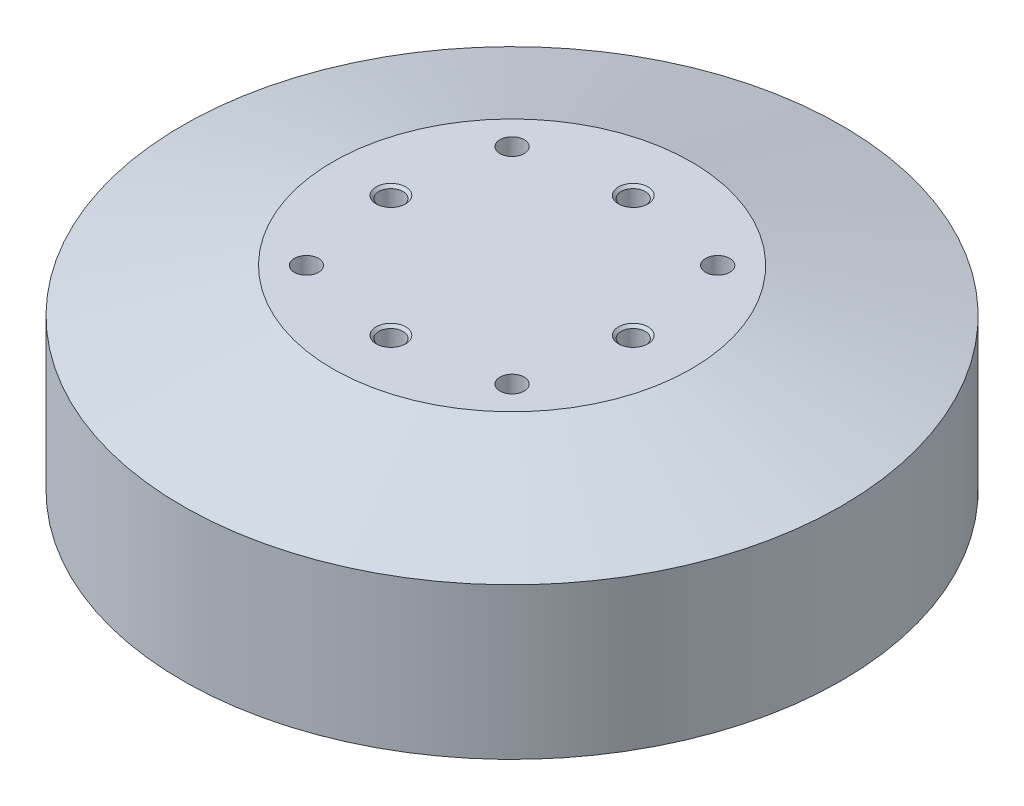
ISO-10303-21;
HEADER;
FILE_DESCRIPTION(('STEP AP214'),'2;1');
FILE_NAME('part.step','',(''),(''),'','','');
FILE_SCHEMA(('AUTOMOTIVE_DESIGN { 1 0 10303 214 1 1 1 1 }'));
ENDSEC;
DATA;
#1=APPLICATION_CONTEXT('core data for automotive mechanical design processes');
#2=APPLICATION_PROTOCOL_DEFINITION('international standard','automotive_design',2000,#1);
#3=PRODUCT_CONTEXT('',#1,'mechanical');
#4=PRODUCT('Part','Part','',(#3));
#5=PRODUCT_RELATED_PRODUCT_CATEGORY('part','',(#4));
#6=PRODUCT_DEFINITION_FORMATION('','',#4);
#7=PRODUCT_DEFINITION_CONTEXT('part definition',#1,'design');
#8=PRODUCT_DEFINITION('design','',#6,#7);
#9=PRODUCT_DEFINITION_SHAPE('','',#8);
#10=(LENGTH_UNIT() NAMED_UNIT(*) SI_UNIT(.MILLI.,.METRE.));
#11=(NAMED_UNIT(*) PLANE_ANGLE_UNIT() SI_UNIT($,.RADIAN.));
#12=(NAMED_UNIT(*) SI_UNIT($,.STERADIAN.) SOLID_ANGLE_UNIT());
#13=UNCERTAINTY_MEASURE_WITH_UNIT(LENGTH_MEASURE(1.E-05),#10,'distance_accuracy_value','');
#14=(GEOMETRIC_REPRESENTATION_CONTEXT(3) GLOBAL_UNCERTAINTY_ASSIGNED_CONTEXT((#13)) GLOBAL_UNIT_ASSIGNED_CONTEXT((#10,
#11,#12)) REPRESENTATION_CONTEXT('',''));
#15=CARTESIAN_POINT('',(0.,0.,0.));
#16=DIRECTION('',(0.,0.,1.));
#17=DIRECTION('',(1.,0.,0.));
#18=AXIS2_PLACEMENT_3D('',#15,#16,#17);
#19=CARTESIAN_POINT('',(0.,-10.05,0.));
#20=DIRECTION('',(0.,-1.,0.));
#21=DIRECTION('',(1.,0.,0.));
#22=AXIS2_PLACEMENT_3D('',#19,#20,#21);
#23=CYLINDRICAL_SURFACE('',#22,34.);
#24=CARTESIAN_POINT('',(0.,5.55,0.));
#25=DIRECTION('',(0.,-1.,0.));
#26=DIRECTION('',(1.,0.,0.));
#27=AXIS2_PLACEMENT_3D('',#24,#25,#26);
#28=CIRCLE('',#27,34.);
#29=CARTESIAN_POINT('',(34.,5.55,0.));
#30=VERTEX_POINT('',#29);
#31=EDGE_CURVE('E142',#30,#30,#28,.T.);
#32=ORIENTED_EDGE('',*,*,#31,.T.);
#33=EDGE_LOOP('',(#32));
#34=FACE_BOUND('',#33,.T.);
#35=CARTESIAN_POINT('',(0.,-10.05,0.));
#36=DIRECTION('',(0.,-1.,0.));
#37=DIRECTION('',(1.,0.,0.));
#38=AXIS2_PLACEMENT_3D('',#35,#36,#37);
#39=CIRCLE('',#38,34.);
#40=CARTESIAN_POINT('',(34.,-10.05,0.));
#41=VERTEX_POINT('',#40);
#42=EDGE_CURVE('E11',#41,#41,#39,.T.);
#43=ORIENTED_EDGE('',*,*,#42,.F.);
#44=EDGE_LOOP('',(#43));
#45=FACE_BOUND('',#44,.T.);
#46=ADVANCED_FACE('F38',(#34,#45),#23,.T.);
#47=CARTESIAN_POINT('',(34.,-10.05,0.));
#48=DIRECTION('',(0.,-1.,0.));
#49=DIRECTION('',(1.,0.,0.));
#50=AXIS2_PLACEMENT_3D('',#47,#48,#49);
#51=PLANE('',#50);
#52=CARTESIAN_POINT('',(0.,-10.05,0.));
#53=DIRECTION('',(0.,-1.,0.));
#54=DIRECTION('',(1.,0.,0.));
#55=AXIS2_PLACEMENT_3D('',#52,#53,#54);
#56=CIRCLE('',#55,33.);
#57=CARTESIAN_POINT('',(33.,-10.05,0.));
#58=VERTEX_POINT('',#57);
#59=EDGE_CURVE('E138',#58,#58,#56,.T.);
#60=ORIENTED_EDGE('',*,*,#59,.F.);
#61=EDGE_LOOP('',(#60));
#62=FACE_BOUND('',#61,.T.);
#63=ORIENTED_EDGE('',*,*,#42,.T.);
#64=EDGE_LOOP('',(#63));
#65=FACE_BOUND('',#64,.T.);
#66=ADVANCED_FACE('F154',(#62,#65),#51,.T.);
#67=CARTESIAN_POINT('',(0.,10.05,0.));
#68=DIRECTION('',(0.,1.,0.));
#69=DIRECTION('',(-1.,0.,0.));
#70=AXIS2_PLACEMENT_3D('',#67,#68,#69);
#71=PLANE('',#70);
#72=CARTESIAN_POINT('',(0.,10.05,-12.5));
#73=DIRECTION('',(0.,1.,0.));
#74=DIRECTION('',(0.,0.,1.));
#75=AXIS2_PLACEMENT_3D('',#72,#73,#74);
#76=CIRCLE('',#75,1.525);
#77=CARTESIAN_POINT('',(0.,10.05,-10.975));
#78=VERTEX_POINT('',#77);
#79=EDGE_CURVE('E87',#78,#78,#76,.T.);
#80=ORIENTED_EDGE('',*,*,#79,.F.);
#81=EDGE_LOOP('',(#80));
#82=FACE_BOUND('',#81,.T.);
#83=CARTESIAN_POINT('',(0.,10.05,12.5));
#84=DIRECTION('',(0.,1.,0.));
#85=DIRECTION('',(0.,0.,1.));
#86=AXIS2_PLACEMENT_3D('',#83,#84,#85);
#87=CIRCLE('',#86,1.525);
#88=CARTESIAN_POINT('',(0.,10.05,14.025));
#89=VERTEX_POINT('',#88);
#90=EDGE_CURVE('E80',#89,#89,#87,.T.);
#91=ORIENTED_EDGE('',*,*,#90,.F.);
#92=EDGE_LOOP('',(#91));
#93=FACE_BOUND('',#92,.T.);
#94=CARTESIAN_POINT('',(-12.5,10.05,0.));
#95=DIRECTION('',(0.,1.,0.));
#96=DIRECTION('',(0.,0.,1.));
#97=AXIS2_PLACEMENT_3D('',#94,#95,#96);
#98=CIRCLE('',#97,1.525);
#99=CARTESIAN_POINT('',(-12.5,10.05,1.525));
#100=VERTEX_POINT('',#99);
#101=EDGE_CURVE('E96',#100,#100,#98,.T.);
#102=ORIENTED_EDGE('',*,*,#101,.F.);
#103=EDGE_LOOP('',(#102));
#104=FACE_BOUND('',#103,.T.);
#105=CARTESIAN_POINT('',(12.5,10.05,0.));
#106=DIRECTION('',(0.,1.,0.));
#107=DIRECTION('',(0.,0.,1.));
#108=AXIS2_PLACEMENT_3D('',#105,#106,#107);
#109=CIRCLE('',#108,1.525);
#110=CARTESIAN_POINT('',(12.5,10.05,1.525));
#111=VERTEX_POINT('',#110);
#112=EDGE_CURVE('E105',#111,#111,#109,.T.);
#113=ORIENTED_EDGE('',*,*,#112,.F.);
#114=EDGE_LOOP('',(#113));
#115=FACE_BOUND('',#114,.T.);
#116=CARTESIAN_POINT('',(-10.6066017177982,10.05,-10.6066017177982));
#117=DIRECTION('',(0.,1.,0.));
#118=DIRECTION('',(0.,0.,1.));
#119=AXIS2_PLACEMENT_3D('',#116,#117,#118);
#120=CIRCLE('',#119,1.24999999999999);
#121=CARTESIAN_POINT('',(-10.6066017177982,10.05,-9.35660171779824));
#122=VERTEX_POINT('',#121);
#123=EDGE_CURVE('E114',#122,#122,#120,.T.);
#124=ORIENTED_EDGE('',*,*,#123,.F.);
#125=EDGE_LOOP('',(#124));
#126=FACE_BOUND('',#125,.T.);
#127=CARTESIAN_POINT('',(10.6066017177982,10.05,-10.6066017177982));
#128=DIRECTION('',(0.,1.,0.));
#129=DIRECTION('',(0.,0.,1.));
#130=AXIS2_PLACEMENT_3D('',#127,#128,#129);
#131=CIRCLE('',#130,1.24999999999999);
#132=CARTESIAN_POINT('',(10.6066017177982,10.05,-9.35660171779821));
#133=VERTEX_POINT('',#132);
#134=EDGE_CURVE('E120',#133,#133,#131,.T.);
#135=ORIENTED_EDGE('',*,*,#134,.F.);
#136=EDGE_LOOP('',(#135));
#137=FACE_BOUND('',#136,.T.);
#138=CARTESIAN_POINT('',(10.6066017177982,10.05,10.6066017177982));
#139=DIRECTION('',(0.,1.,0.));
#140=DIRECTION('',(0.,0.,1.));
#141=AXIS2_PLACEMENT_3D('',#138,#139,#140);
#142=CIRCLE('',#141,1.24999999999999);
#143=CARTESIAN_POINT('',(10.6066017177982,10.05,11.8566017177982));
#144=VERTEX_POINT('',#143);
#145=EDGE_CURVE('E126',#144,#144,#142,.T.);
#146=ORIENTED_EDGE('',*,*,#145,.F.);
#147=EDGE_LOOP('',(#146));
#148=FACE_BOUND('',#147,.T.);
#149=CARTESIAN_POINT('',(-10.6066017177982,10.05,10.6066017177982));
#150=DIRECTION('',(0.,1.,0.));
#151=DIRECTION('',(0.,0.,1.));
#152=AXIS2_PLACEMENT_3D('',#149,#150,#151);
#153=CIRCLE('',#152,1.24999999999999);
#154=CARTESIAN_POINT('',(-10.6066017177982,10.05,11.8566017177982));
#155=VERTEX_POINT('',#154);
#156=EDGE_CURVE('E132',#155,#155,#153,.T.);
#157=ORIENTED_EDGE('',*,*,#156,.F.);
#158=EDGE_LOOP('',(#157));
#159=FACE_BOUND('',#158,.T.);
#160=CARTESIAN_POINT('',(0.,10.05,0.));
#161=DIRECTION('',(0.,-1.,0.));
#162=DIRECTION('',(1.,0.,0.));
#163=AXIS2_PLACEMENT_3D('',#160,#161,#162);
#164=CIRCLE('',#163,18.5);
#165=CARTESIAN_POINT('',(18.5,10.05,0.));
#166=VERTEX_POINT('',#165);
#167=EDGE_CURVE('E45',#166,#166,#164,.T.);
#168=ORIENTED_EDGE('',*,*,#167,.F.);
#169=EDGE_LOOP('',(#168));
#170=FACE_BOUND('',#169,.T.);
#171=ADVANCED_FACE('F152',(#82,#93,#104,#115,#126,#137,#148,#159,#170),#71,.T.);
#172=CARTESIAN_POINT('',(0.,5.55,0.));
#173=DIRECTION('',(0.,-1.,0.));
#174=DIRECTION('',(1.,0.,0.));
#175=AXIS2_PLACEMENT_3D('',#172,#173,#174);
#176=CONICAL_SURFACE('',#175,34.,1.28824137432531);
#177=ORIENTED_EDGE('',*,*,#167,.T.);
#178=EDGE_LOOP('',(#177));
#179=FACE_BOUND('',#178,.T.);
#180=ORIENTED_EDGE('',*,*,#31,.F.);
#181=EDGE_LOOP('',(#180));
#182=FACE_BOUND('',#181,.T.);
#183=ADVANCED_FACE('F149',(#179,#182),#176,.T.);
#184=CARTESIAN_POINT('',(0.,-8.05,0.));
#185=DIRECTION('',(0.,-1.,0.));
#186=DIRECTION('',(1.,0.,0.));
#187=AXIS2_PLACEMENT_3D('',#184,#185,#186);
#188=CYLINDRICAL_SURFACE('',#187,33.);
#189=CARTESIAN_POINT('',(0.,-8.05,0.));
#190=DIRECTION('',(0.,-1.,0.));
#191=DIRECTION('',(1.,0.,0.));
#192=AXIS2_PLACEMENT_3D('',#189,#190,#191);
#193=CIRCLE('',#192,33.);
#194=CARTESIAN_POINT('',(33.,-8.04999999999999,0.));
#195=VERTEX_POINT('',#194);
#196=EDGE_CURVE('E139',#195,#195,#193,.T.);
#197=ORIENTED_EDGE('',*,*,#196,.F.);
#198=EDGE_LOOP('',(#197));
#199=FACE_BOUND('',#198,.T.);
#200=ORIENTED_EDGE('',*,*,#59,.T.);
#201=EDGE_LOOP('',(#200));
#202=FACE_BOUND('',#201,.T.);
#203=ADVANCED_FACE('F162',(#199,#202),#188,.F.);
#204=CARTESIAN_POINT('',(0.,-8.05,0.));
#205=DIRECTION('',(0.,-1.,0.));
#206=DIRECTION('',(1.,0.,0.));
#207=AXIS2_PLACEMENT_3D('',#204,#205,#206);
#208=PLANE('',#207);
#209=ORIENTED_EDGE('',*,*,#196,.T.);
#210=EDGE_LOOP('',(#209));
#211=FACE_BOUND('',#210,.T.);
#212=ADVANCED_FACE('F194',(#211),#208,.T.);
#213=CARTESIAN_POINT('',(-10.6066017177982,2.55,10.6066017177982));
#214=DIRECTION('',(0.,1.,0.));
#215=DIRECTION('',(0.,0.,1.));
#216=AXIS2_PLACEMENT_3D('',#213,#214,#215);
#217=CONICAL_SURFACE('',#216,1.25,1.02974425867665);
#218=CARTESIAN_POINT('',(-10.6066017177982,1.79892422621555,10.6066017177982));
#219=VERTEX_POINT('',#218);
#220=VERTEX_LOOP('',#219);
#221=FACE_BOUND('',#220,.T.);
#222=CARTESIAN_POINT('',(-10.6066017177982,2.55,10.6066017177982));
#223=DIRECTION('',(0.,1.,0.));
#224=DIRECTION('',(0.,0.,1.));
#225=AXIS2_PLACEMENT_3D('',#222,#223,#224);
#226=CIRCLE('',#225,1.25);
#227=CARTESIAN_POINT('',(-10.6066017177982,2.55,11.8566017177982));
#228=VERTEX_POINT('',#227);
#229=EDGE_CURVE('E135',#228,#228,#226,.T.);
#230=ORIENTED_EDGE('',*,*,#229,.T.);
#231=EDGE_LOOP('',(#230));
#232=FACE_BOUND('',#231,.T.);
#233=ADVANCED_FACE('F202',(#221,#232),#217,.F.);
#234=CARTESIAN_POINT('',(-10.6066017177982,10.05,10.6066017177982));
#235=DIRECTION('',(0.,1.,0.));
#236=DIRECTION('',(0.,0.,1.));
#237=AXIS2_PLACEMENT_3D('',#234,#235,#236);
#238=CYLINDRICAL_SURFACE('',#237,1.24999999999999);
#239=ORIENTED_EDGE('',*,*,#229,.F.);
#240=EDGE_LOOP('',(#239));
#241=FACE_BOUND('',#240,.T.);
#242=ORIENTED_EDGE('',*,*,#156,.T.);
#243=EDGE_LOOP('',(#242));
#244=FACE_BOUND('',#243,.T.);
#245=ADVANCED_FACE('F210',(#241,#244),#238,.F.);
#246=CARTESIAN_POINT('',(10.6066017177982,2.55,10.6066017177982));
#247=DIRECTION('',(0.,1.,0.));
#248=DIRECTION('',(0.,0.,1.));
#249=AXIS2_PLACEMENT_3D('',#246,#247,#248);
#250=CONICAL_SURFACE('',#249,1.25,1.02974425867665);
#251=CARTESIAN_POINT('',(10.6066017177982,1.79892422621555,10.6066017177982));
#252=VERTEX_POINT('',#251);
#253=VERTEX_LOOP('',#252);
#254=FACE_BOUND('',#253,.T.);
#255=CARTESIAN_POINT('',(10.6066017177982,2.55,10.6066017177982));
#256=DIRECTION('',(0.,1.,0.));
#257=DIRECTION('',(0.,0.,1.));
#258=AXIS2_PLACEMENT_3D('',#255,#256,#257);
#259=CIRCLE('',#258,1.25);
#260=CARTESIAN_POINT('',(10.6066017177982,2.55,11.8566017177982));
#261=VERTEX_POINT('',#260);
#262=EDGE_CURVE('E129',#261,#261,#259,.T.);
#263=ORIENTED_EDGE('',*,*,#262,.T.);
#264=EDGE_LOOP('',(#263));
#265=FACE_BOUND('',#264,.T.);
#266=ADVANCED_FACE('F218',(#254,#265),#250,.F.);
#267=CARTESIAN_POINT('',(10.6066017177982,10.05,10.6066017177982));
#268=DIRECTION('',(0.,1.,0.));
#269=DIRECTION('',(0.,0.,1.));
#270=AXIS2_PLACEMENT_3D('',#267,#268,#269);
#271=CYLINDRICAL_SURFACE('',#270,1.24999999999999);
#272=ORIENTED_EDGE('',*,*,#262,.F.);
#273=EDGE_LOOP('',(#272));
#274=FACE_BOUND('',#273,.T.);
#275=ORIENTED_EDGE('',*,*,#145,.T.);
#276=EDGE_LOOP('',(#275));
#277=FACE_BOUND('',#276,.T.);
#278=ADVANCED_FACE('F227',(#274,#277),#271,.F.);
#279=CARTESIAN_POINT('',(10.6066017177982,2.55,-10.6066017177982));
#280=DIRECTION('',(0.,1.,0.));
#281=DIRECTION('',(0.,0.,1.));
#282=AXIS2_PLACEMENT_3D('',#279,#280,#281);
#283=CONICAL_SURFACE('',#282,1.25,1.02974425867665);
#284=CARTESIAN_POINT('',(10.6066017177982,1.79892422621555,-10.6066017177982));
#285=VERTEX_POINT('',#284);
#286=VERTEX_LOOP('',#285);
#287=FACE_BOUND('',#286,.T.);
#288=CARTESIAN_POINT('',(10.6066017177982,2.55,-10.6066017177982));
#289=DIRECTION('',(0.,1.,0.));
#290=DIRECTION('',(0.,0.,1.));
#291=AXIS2_PLACEMENT_3D('',#288,#289,#290);
#292=CIRCLE('',#291,1.25);
#293=CARTESIAN_POINT('',(10.6066017177982,2.55,-9.3566017177982));
#294=VERTEX_POINT('',#293);
#295=EDGE_CURVE('E123',#294,#294,#292,.T.);
#296=ORIENTED_EDGE('',*,*,#295,.T.);
#297=EDGE_LOOP('',(#296));
#298=FACE_BOUND('',#297,.T.);
#299=ADVANCED_FACE('F234',(#287,#298),#283,.F.);
#300=CARTESIAN_POINT('',(10.6066017177982,10.05,-10.6066017177982));
#301=DIRECTION('',(0.,1.,0.));
#302=DIRECTION('',(0.,0.,1.));
#303=AXIS2_PLACEMENT_3D('',#300,#301,#302);
#304=CYLINDRICAL_SURFACE('',#303,1.24999999999999);
#305=ORIENTED_EDGE('',*,*,#295,.F.);
#306=EDGE_LOOP('',(#305));
#307=FACE_BOUND('',#306,.T.);
#308=ORIENTED_EDGE('',*,*,#134,.T.);
#309=EDGE_LOOP('',(#308));
#310=FACE_BOUND('',#309,.T.);
#311=ADVANCED_FACE('F243',(#307,#310),#304,.F.);
#312=CARTESIAN_POINT('',(-10.6066017177982,2.55,-10.6066017177982));
#313=DIRECTION('',(0.,1.,0.));
#314=DIRECTION('',(0.,0.,1.));
#315=AXIS2_PLACEMENT_3D('',#312,#313,#314);
#316=CONICAL_SURFACE('',#315,1.25,1.02974425867665);
#317=CARTESIAN_POINT('',(-10.6066017177982,1.79892422621555,-10.6066017177982));
#318=VERTEX_POINT('',#317);
#319=VERTEX_LOOP('',#318);
#320=FACE_BOUND('',#319,.T.);
#321=CARTESIAN_POINT('',(-10.6066017177982,2.55,-10.6066017177982));
#322=DIRECTION('',(0.,1.,0.));
#323=DIRECTION('',(0.,0.,1.));
#324=AXIS2_PLACEMENT_3D('',#321,#322,#323);
#325=CIRCLE('',#324,1.25);
#326=CARTESIAN_POINT('',(-10.6066017177982,2.55,-9.35660171779823));
#327=VERTEX_POINT('',#326);
#328=EDGE_CURVE('E117',#327,#327,#325,.T.);
#329=ORIENTED_EDGE('',*,*,#328,.T.);
#330=EDGE_LOOP('',(#329));
#331=FACE_BOUND('',#330,.T.);
#332=ADVANCED_FACE('F251',(#320,#331),#316,.F.);
#333=CARTESIAN_POINT('',(-10.6066017177982,10.05,-10.6066017177982));
#334=DIRECTION('',(0.,1.,0.));
#335=DIRECTION('',(0.,0.,1.));
#336=AXIS2_PLACEMENT_3D('',#333,#334,#335);
#337=CYLINDRICAL_SURFACE('',#336,1.24999999999999);
#338=ORIENTED_EDGE('',*,*,#328,.F.);
#339=EDGE_LOOP('',(#338));
#340=FACE_BOUND('',#339,.T.);
#341=ORIENTED_EDGE('',*,*,#123,.T.);
#342=EDGE_LOOP('',(#341));
#343=FACE_BOUND('',#342,.T.);
#344=ADVANCED_FACE('F260',(#340,#343),#337,.F.);
#345=CARTESIAN_POINT('',(12.5,2.55000000000001,0.));
#346=DIRECTION('',(0.,1.,0.));
#347=DIRECTION('',(0.,0.,1.));
#348=AXIS2_PLACEMENT_3D('',#345,#346,#347);
#349=CONICAL_SURFACE('',#348,1.24999999999999,1.02974425867665);
#350=CARTESIAN_POINT('',(12.5,1.79892422621556,0.));
#351=VERTEX_POINT('',#350);
#352=VERTEX_LOOP('',#351);
#353=FACE_BOUND('',#352,.T.);
#354=CARTESIAN_POINT('',(12.5,2.55000000000001,0.));
#355=DIRECTION('',(0.,1.,0.));
#356=DIRECTION('',(0.,0.,1.));
#357=AXIS2_PLACEMENT_3D('',#354,#355,#356);
#358=CIRCLE('',#357,1.24999999999999);
#359=CARTESIAN_POINT('',(12.5,2.55000000000001,1.24999999999999));
#360=VERTEX_POINT('',#359);
#361=EDGE_CURVE('E111',#360,#360,#358,.T.);
#362=ORIENTED_EDGE('',*,*,#361,.T.);
#363=EDGE_LOOP('',(#362));
#364=FACE_BOUND('',#363,.T.);
#365=ADVANCED_FACE('F267',(#353,#364),#349,.F.);
#366=CARTESIAN_POINT('',(12.5,10.05,0.));
#367=DIRECTION('',(0.,1.,0.));
#368=DIRECTION('',(0.,0.,1.));
#369=AXIS2_PLACEMENT_3D('',#366,#367,#368);
#370=CYLINDRICAL_SURFACE('',#369,1.24999999999999);
#371=ORIENTED_EDGE('',*,*,#361,.F.);
#372=EDGE_LOOP('',(#371));
#373=FACE_BOUND('',#372,.T.);
#374=CARTESIAN_POINT('',(12.5,9.775,0.));
#375=DIRECTION('',(0.,1.,0.));
#376=DIRECTION('',(0.,0.,1.));
#377=AXIS2_PLACEMENT_3D('',#374,#375,#376);
#378=CIRCLE('',#377,1.25);
#379=CARTESIAN_POINT('',(12.5,9.775,1.25));
#380=VERTEX_POINT('',#379);
#381=EDGE_CURVE('E108',#380,#380,#378,.T.);
#382=ORIENTED_EDGE('',*,*,#381,.T.);
#383=EDGE_LOOP('',(#382));
#384=FACE_BOUND('',#383,.T.);
#385=ADVANCED_FACE('F275',(#373,#384),#370,.F.);
#386=CARTESIAN_POINT('',(12.5,10.05,0.));
#387=DIRECTION('',(0.,1.,0.));
#388=DIRECTION('',(0.,0.,1.));
#389=AXIS2_PLACEMENT_3D('',#386,#387,#388);
#390=CONICAL_SURFACE('',#389,1.525,0.785398163397445);
#391=ORIENTED_EDGE('',*,*,#381,.F.);
#392=EDGE_LOOP('',(#391));
#393=FACE_BOUND('',#392,.T.);
#394=ORIENTED_EDGE('',*,*,#112,.T.);
#395=EDGE_LOOP('',(#394));
#396=FACE_BOUND('',#395,.T.);
#397=ADVANCED_FACE('F283',(#393,#396),#390,.F.);
#398=CARTESIAN_POINT('',(-12.5,2.55,0.));
#399=DIRECTION('',(0.,1.,0.));
#400=DIRECTION('',(0.,0.,1.));
#401=AXIS2_PLACEMENT_3D('',#398,#399,#400);
#402=CONICAL_SURFACE('',#401,1.24999999999999,1.02974425867665);
#403=CARTESIAN_POINT('',(-12.5,1.79892422621556,0.));
#404=VERTEX_POINT('',#403);
#405=VERTEX_LOOP('',#404);
#406=FACE_BOUND('',#405,.T.);
#407=CARTESIAN_POINT('',(-12.5,2.55,0.));
#408=DIRECTION('',(0.,1.,0.));
#409=DIRECTION('',(0.,0.,1.));
#410=AXIS2_PLACEMENT_3D('',#407,#408,#409);
#411=CIRCLE('',#410,1.24999999999999);
#412=CARTESIAN_POINT('',(-12.5,2.55,1.24999999999999));
#413=VERTEX_POINT('',#412);
#414=EDGE_CURVE('E102',#413,#413,#411,.T.);
#415=ORIENTED_EDGE('',*,*,#414,.T.);
#416=EDGE_LOOP('',(#415));
#417=FACE_BOUND('',#416,.T.);
#418=ADVANCED_FACE('F292',(#406,#417),#402,.F.);
#419=CARTESIAN_POINT('',(-12.5,10.05,0.));
#420=DIRECTION('',(0.,1.,0.));
#421=DIRECTION('',(0.,0.,1.));
#422=AXIS2_PLACEMENT_3D('',#419,#420,#421);
#423=CYLINDRICAL_SURFACE('',#422,1.24999999999999);
#424=ORIENTED_EDGE('',*,*,#414,.F.);
#425=EDGE_LOOP('',(#424));
#426=FACE_BOUND('',#425,.T.);
#427=CARTESIAN_POINT('',(-12.5,9.775,0.));
#428=DIRECTION('',(0.,1.,0.));
#429=DIRECTION('',(0.,0.,1.));
#430=AXIS2_PLACEMENT_3D('',#427,#428,#429);
#431=CIRCLE('',#430,1.25);
#432=CARTESIAN_POINT('',(-12.5,9.775,1.25));
#433=VERTEX_POINT('',#432);
#434=EDGE_CURVE('E99',#433,#433,#431,.T.);
#435=ORIENTED_EDGE('',*,*,#434,.T.);
#436=EDGE_LOOP('',(#435));
#437=FACE_BOUND('',#436,.T.);
#438=ADVANCED_FACE('F300',(#426,#437),#423,.F.);
#439=CARTESIAN_POINT('',(-12.5,10.05,0.));
#440=DIRECTION('',(0.,1.,0.));
#441=DIRECTION('',(0.,0.,1.));
#442=AXIS2_PLACEMENT_3D('',#439,#440,#441);
#443=CONICAL_SURFACE('',#442,1.525,0.785398163397445);
#444=ORIENTED_EDGE('',*,*,#434,.F.);
#445=EDGE_LOOP('',(#444));
#446=FACE_BOUND('',#445,.T.);
#447=ORIENTED_EDGE('',*,*,#101,.T.);
#448=EDGE_LOOP('',(#447));
#449=FACE_BOUND('',#448,.T.);
#450=ADVANCED_FACE('F308',(#446,#449),#443,.F.);
#451=CARTESIAN_POINT('',(0.,2.55000000000001,12.5));
#452=DIRECTION('',(0.,1.,0.));
#453=DIRECTION('',(0.,0.,1.));
#454=AXIS2_PLACEMENT_3D('',#451,#452,#453);
#455=CONICAL_SURFACE('',#454,1.24999999999999,1.02974425867665);
#456=CARTESIAN_POINT('',(0.,1.79892422621556,12.5));
#457=VERTEX_POINT('',#456);
#458=VERTEX_LOOP('',#457);
#459=FACE_BOUND('',#458,.T.);
#460=CARTESIAN_POINT('',(0.,2.55000000000001,12.5));
#461=DIRECTION('',(0.,1.,0.));
#462=DIRECTION('',(0.,0.,1.));
#463=AXIS2_PLACEMENT_3D('',#460,#461,#462);
#464=CIRCLE('',#463,1.24999999999999);
#465=CARTESIAN_POINT('',(0.,2.55000000000001,13.75));
#466=VERTEX_POINT('',#465);
#467=EDGE_CURVE('E93',#466,#466,#464,.T.);
#468=ORIENTED_EDGE('',*,*,#467,.T.);
#469=EDGE_LOOP('',(#468));
#470=FACE_BOUND('',#469,.T.);
#471=ADVANCED_FACE('F317',(#459,#470),#455,.F.);
#472=CARTESIAN_POINT('',(0.,10.05,12.5));
#473=DIRECTION('',(0.,1.,0.));
#474=DIRECTION('',(0.,0.,1.));
#475=AXIS2_PLACEMENT_3D('',#472,#473,#474);
#476=CYLINDRICAL_SURFACE('',#475,1.24999999999999);
#477=ORIENTED_EDGE('',*,*,#467,.F.);
#478=EDGE_LOOP('',(#477));
#479=FACE_BOUND('',#478,.T.);
#480=CARTESIAN_POINT('',(0.,9.775,12.5));
#481=DIRECTION('',(0.,1.,0.));
#482=DIRECTION('',(0.,0.,1.));
#483=AXIS2_PLACEMENT_3D('',#480,#481,#482);
#484=CIRCLE('',#483,1.25);
#485=CARTESIAN_POINT('',(0.,9.775,13.75));
#486=VERTEX_POINT('',#485);
#487=EDGE_CURVE('E84',#486,#486,#484,.T.);
#488=ORIENTED_EDGE('',*,*,#487,.T.);
#489=EDGE_LOOP('',(#488));
#490=FACE_BOUND('',#489,.T.);
#491=ADVANCED_FACE('F325',(#479,#490),#476,.F.);
#492=CARTESIAN_POINT('',(0.,10.05,12.5));
#493=DIRECTION('',(0.,1.,0.));
#494=DIRECTION('',(0.,0.,1.));
#495=AXIS2_PLACEMENT_3D('',#492,#493,#494);
#496=CONICAL_SURFACE('',#495,1.525,0.785398163397446);
#497=ORIENTED_EDGE('',*,*,#487,.F.);
#498=EDGE_LOOP('',(#497));
#499=FACE_BOUND('',#498,.T.);
#500=ORIENTED_EDGE('',*,*,#90,.T.);
#501=EDGE_LOOP('',(#500));
#502=FACE_BOUND('',#501,.T.);
#503=ADVANCED_FACE('F74',(#499,#502),#496,.F.);
#504=CARTESIAN_POINT('',(0.,2.55000000000001,-12.5));
#505=DIRECTION('',(0.,1.,0.));
#506=DIRECTION('',(0.,0.,1.));
#507=AXIS2_PLACEMENT_3D('',#504,#505,#506);
#508=CONICAL_SURFACE('',#507,1.24999999999999,1.02974425867665);
#509=CARTESIAN_POINT('',(0.,1.79892422621556,-12.5));
#510=VERTEX_POINT('',#509);
#511=VERTEX_LOOP('',#510);
#512=FACE_BOUND('',#511,.T.);
#513=CARTESIAN_POINT('',(0.,2.55000000000001,-12.5));
#514=DIRECTION('',(0.,1.,0.));
#515=DIRECTION('',(0.,0.,1.));
#516=AXIS2_PLACEMENT_3D('',#513,#514,#515);
#517=CIRCLE('',#516,1.24999999999999);
#518=CARTESIAN_POINT('',(0.,2.55000000000001,-11.25));
#519=VERTEX_POINT('',#518);
#520=EDGE_CURVE('E78',#519,#519,#517,.T.);
#521=ORIENTED_EDGE('',*,*,#520,.T.);
#522=EDGE_LOOP('',(#521));
#523=FACE_BOUND('',#522,.T.);
#524=ADVANCED_FACE('F70',(#512,#523),#508,.F.);
#525=CARTESIAN_POINT('',(0.,10.05,-12.5));
#526=DIRECTION('',(0.,1.,0.));
#527=DIRECTION('',(0.,0.,1.));
#528=AXIS2_PLACEMENT_3D('',#525,#526,#527);
#529=CYLINDRICAL_SURFACE('',#528,1.24999999999999);
#530=ORIENTED_EDGE('',*,*,#520,.F.);
#531=EDGE_LOOP('',(#530));
#532=FACE_BOUND('',#531,.T.);
#533=CARTESIAN_POINT('',(0.,9.775,-12.5));
#534=DIRECTION('',(0.,1.,0.));
#535=DIRECTION('',(0.,0.,1.));
#536=AXIS2_PLACEMENT_3D('',#533,#534,#535);
#537=CIRCLE('',#536,1.25);
#538=CARTESIAN_POINT('',(0.,9.775,-11.25));
#539=VERTEX_POINT('',#538);
#540=EDGE_CURVE('E81',#539,#539,#537,.T.);
#541=ORIENTED_EDGE('',*,*,#540,.T.);
#542=EDGE_LOOP('',(#541));
#543=FACE_BOUND('',#542,.T.);
#544=ADVANCED_FACE('F73',(#532,#543),#529,.F.);
#545=CARTESIAN_POINT('',(0.,10.05,-12.5));
#546=DIRECTION('',(0.,1.,0.));
#547=DIRECTION('',(0.,0.,1.));
#548=AXIS2_PLACEMENT_3D('',#545,#546,#547);
#549=CONICAL_SURFACE('',#548,1.525,0.785398163397446);
#550=ORIENTED_EDGE('',*,*,#540,.F.);
#551=EDGE_LOOP('',(#550));
#552=FACE_BOUND('',#551,.T.);
#553=ORIENTED_EDGE('',*,*,#79,.T.);
#554=EDGE_LOOP('',(#553));
#555=FACE_BOUND('',#554,.T.);
#556=ADVANCED_FACE('F352',(#552,#555),#549,.F.);
#557=CLOSED_SHELL('',(#46,#66,#171,#183,#203,#212,#233,#245,#266,#278,#299,#311,#332,#344,#365,
#385,#397,#418,#438,#450,#471,#491,#503,#524,#544,#556));
#558=MANIFOLD_SOLID_BREP('B2',#557);
#559=ADVANCED_BREP_SHAPE_REPRESENTATION('',(#18,#558),#14);
#560=SHAPE_DEFINITION_REPRESENTATION(#9,#559);
ENDSEC;
END-ISO-10303-21;
